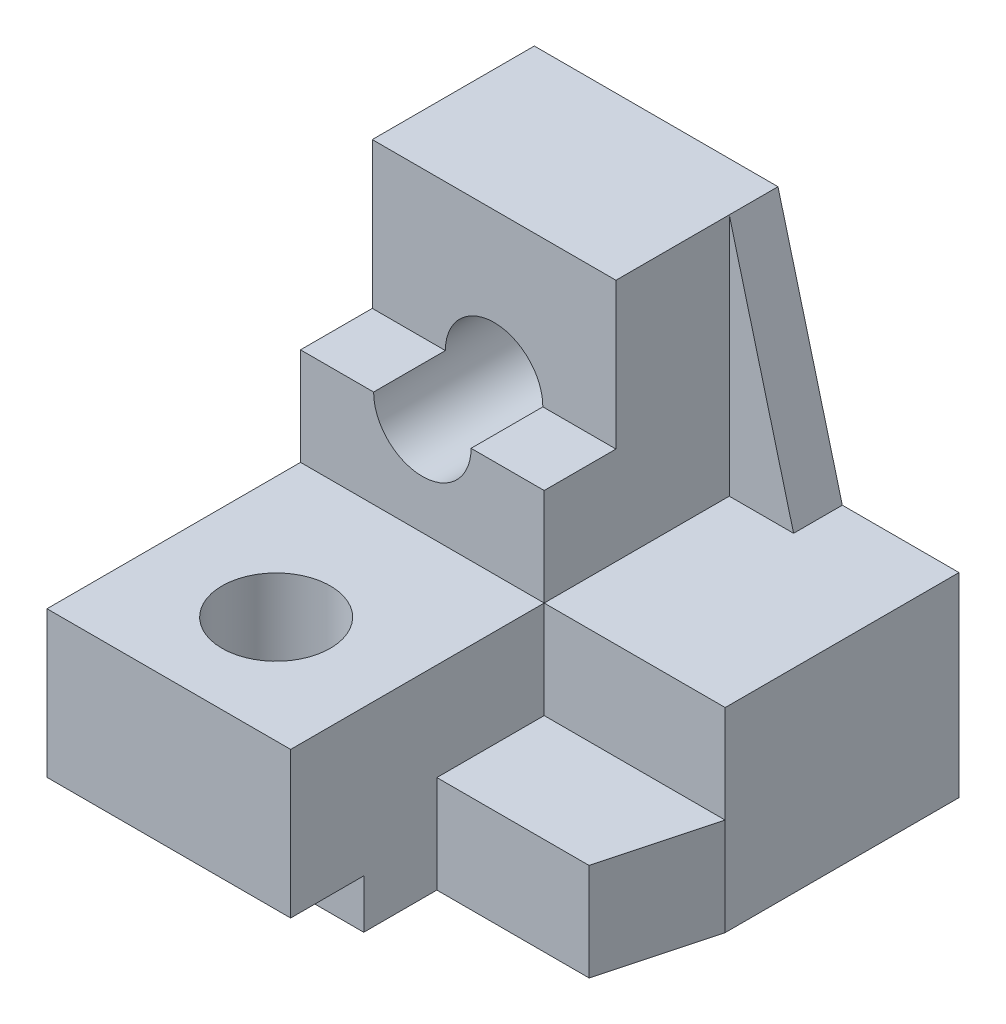
ISO-10303-21;
HEADER;
FILE_DESCRIPTION(('STEP AP214'),'2;1');
FILE_NAME('part.step','',(''),(''),'','','');
FILE_SCHEMA(('AUTOMOTIVE_DESIGN { 1 0 10303 214 1 1 1 1 }'));
ENDSEC;
DATA;
#1=APPLICATION_CONTEXT('core data for automotive mechanical design processes');
#2=APPLICATION_PROTOCOL_DEFINITION('international standard','automotive_design',2000,#1);
#3=PRODUCT_CONTEXT('',#1,'mechanical');
#4=PRODUCT('Part','Part','',(#3));
#5=PRODUCT_RELATED_PRODUCT_CATEGORY('part','',(#4));
#6=PRODUCT_DEFINITION_FORMATION('','',#4);
#7=PRODUCT_DEFINITION_CONTEXT('part definition',#1,'design');
#8=PRODUCT_DEFINITION('design','',#6,#7);
#9=PRODUCT_DEFINITION_SHAPE('','',#8);
#10=(LENGTH_UNIT() NAMED_UNIT(*) SI_UNIT(.MILLI.,.METRE.));
#11=(NAMED_UNIT(*) PLANE_ANGLE_UNIT() SI_UNIT($,.RADIAN.));
#12=(NAMED_UNIT(*) SI_UNIT($,.STERADIAN.) SOLID_ANGLE_UNIT());
#13=UNCERTAINTY_MEASURE_WITH_UNIT(LENGTH_MEASURE(1.E-05),#10,'distance_accuracy_value','');
#14=(GEOMETRIC_REPRESENTATION_CONTEXT(3) GLOBAL_UNCERTAINTY_ASSIGNED_CONTEXT((#13)) GLOBAL_UNIT_ASSIGNED_CONTEXT((#10,
#11,#12)) REPRESENTATION_CONTEXT('',''));
#15=CARTESIAN_POINT('',(0.,0.,0.));
#16=DIRECTION('',(0.,0.,1.));
#17=DIRECTION('',(1.,0.,0.));
#18=AXIS2_PLACEMENT_3D('',#15,#16,#17);
#19=CARTESIAN_POINT('',(0.,60.,0.));
#20=DIRECTION('',(0.,1.,0.));
#21=DIRECTION('',(0.,0.,1.));
#22=AXIS2_PLACEMENT_3D('',#19,#20,#21);
#23=PLANE('',#22);
#24=DIRECTION('',(0.,0.,1.));
#25=VECTOR('',#24,1.);
#26=CARTESIAN_POINT('',(-35.,60.,-50.));
#27=LINE('',#26,#25);
#28=CARTESIAN_POINT('',(-35.,60.,-16.7497125938639));
#29=VERTEX_POINT('',#28);
#30=CARTESIAN_POINT('',(-35.,60.,-2.02212351296029));
#31=VERTEX_POINT('',#30);
#32=EDGE_CURVE('E223',#29,#31,#27,.T.);
#33=ORIENTED_EDGE('',*,*,#32,.F.);
#34=DIRECTION('',(1.,0.,0.));
#35=VECTOR('',#34,1.);
#36=CARTESIAN_POINT('',(-50.,60.,-16.7497125938639));
#37=LINE('',#36,#35);
#38=CARTESIAN_POINT('',(-50.,60.,-16.7497125938639));
#39=VERTEX_POINT('',#38);
#40=EDGE_CURVE('E211',#39,#29,#37,.T.);
#41=ORIENTED_EDGE('',*,*,#40,.F.);
#42=DIRECTION('',(0.,0.,1.));
#43=VECTOR('',#42,1.);
#44=CARTESIAN_POINT('',(-50.,60.,-50.));
#45=LINE('',#44,#43);
#46=CARTESIAN_POINT('',(-50.,60.,-2.02212351296029));
#47=VERTEX_POINT('',#46);
#48=EDGE_CURVE('E227',#39,#47,#45,.T.);
#49=ORIENTED_EDGE('',*,*,#48,.T.);
#50=DIRECTION('',(1.,0.,0.));
#51=VECTOR('',#50,1.);
#52=CARTESIAN_POINT('',(-50.,60.,-2.02212351296029));
#53=LINE('',#52,#51);
#54=EDGE_CURVE('E230',#47,#31,#53,.T.);
#55=ORIENTED_EDGE('',*,*,#54,.T.);
#56=EDGE_LOOP('',(#33,#41,#49,#55));
#57=FACE_BOUND('',#56,.T.);
#58=ADVANCED_FACE('F39',(#57),#23,.T.);
#59=DIRECTION('',(0.,0.,-1.));
#60=VECTOR('',#59,1.);
#61=CARTESIAN_POINT('',(0.,60.,-50.));
#62=LINE('',#61,#60);
#63=CARTESIAN_POINT('',(0.,60.,-2.02212351296029));
#64=VERTEX_POINT('',#63);
#65=CARTESIAN_POINT('',(0.,60.,-16.7497125938639));
#66=VERTEX_POINT('',#65);
#67=EDGE_CURVE('E54',#64,#66,#62,.T.);
#68=ORIENTED_EDGE('',*,*,#67,.T.);
#69=CARTESIAN_POINT('',(-15.,60.,-16.7497125938639));
#70=VERTEX_POINT('',#69);
#71=EDGE_CURVE('E210',#70,#66,#37,.T.);
#72=ORIENTED_EDGE('',*,*,#71,.F.);
#73=DIRECTION('',(0.,0.,1.));
#74=VECTOR('',#73,1.);
#75=CARTESIAN_POINT('',(-15.,60.,-50.));
#76=LINE('',#75,#74);
#77=CARTESIAN_POINT('',(-15.,60.,-2.02212351296029));
#78=VERTEX_POINT('',#77);
#79=EDGE_CURVE('E59',#70,#78,#76,.T.);
#80=ORIENTED_EDGE('',*,*,#79,.T.);
#81=EDGE_CURVE('E229',#78,#64,#53,.T.);
#82=ORIENTED_EDGE('',*,*,#81,.T.);
#83=EDGE_LOOP('',(#68,#72,#80,#82));
#84=FACE_BOUND('',#83,.T.);
#85=ADVANCED_FACE('F358',(#84),#23,.T.);
#86=CARTESIAN_POINT('',(0.,40.,0.));
#87=DIRECTION('',(0.,-1.,0.));
#88=DIRECTION('',(0.,0.,-1.));
#89=AXIS2_PLACEMENT_3D('',#86,#87,#88);
#90=PLANE('',#89);
#91=DIRECTION('',(-1.,0.,0.));
#92=VECTOR('',#91,1.);
#93=CARTESIAN_POINT('',(-50.,40.,-50.));
#94=LINE('',#93,#92);
#95=CARTESIAN_POINT('',(37.1443667407374,40.,-50.));
#96=VERTEX_POINT('',#95);
#97=CARTESIAN_POINT('',(13.2014210229221,40.,-50.));
#98=VERTEX_POINT('',#97);
#99=EDGE_CURVE('E252',#96,#98,#94,.T.);
#100=ORIENTED_EDGE('',*,*,#99,.T.);
#101=DIRECTION('',(0.,0.,-1.));
#102=VECTOR('',#101,1.);
#103=CARTESIAN_POINT('',(13.2014210229221,40.,-40.));
#104=LINE('',#103,#102);
#105=CARTESIAN_POINT('',(13.2014210229221,40.,-40.));
#106=VERTEX_POINT('',#105);
#107=EDGE_CURVE('E177',#106,#98,#104,.T.);
#108=ORIENTED_EDGE('',*,*,#107,.F.);
#109=DIRECTION('',(-1.,0.,0.));
#110=VECTOR('',#109,1.);
#111=CARTESIAN_POINT('',(13.2014210229221,40.,-40.));
#112=LINE('',#111,#110);
#113=CARTESIAN_POINT('',(0.,40.,-40.));
#114=VERTEX_POINT('',#113);
#115=EDGE_CURVE('E178',#106,#114,#112,.T.);
#116=ORIENTED_EDGE('',*,*,#115,.T.);
#117=DIRECTION('',(0.,0.,-1.));
#118=VECTOR('',#117,1.);
#119=CARTESIAN_POINT('',(0.,40.,-50.));
#120=LINE('',#119,#118);
#121=CARTESIAN_POINT('',(0.,40.,-2.02212351296029));
#122=VERTEX_POINT('',#121);
#123=EDGE_CURVE('E194',#122,#114,#120,.T.);
#124=ORIENTED_EDGE('',*,*,#123,.F.);
#125=DIRECTION('',(1.,0.,0.));
#126=VECTOR('',#125,1.);
#127=CARTESIAN_POINT('',(-50.,40.,-2.0221235129603));
#128=LINE('',#127,#126);
#129=CARTESIAN_POINT('',(37.1443667407374,40.,-2.0221235129603));
#130=VERTEX_POINT('',#129);
#131=EDGE_CURVE('E248',#122,#130,#128,.T.);
#132=ORIENTED_EDGE('',*,*,#131,.T.);
#133=DIRECTION('',(0.,0.,-1.));
#134=VECTOR('',#133,1.);
#135=CARTESIAN_POINT('',(37.1443667407374,40.,-50.));
#136=LINE('',#135,#134);
#137=EDGE_CURVE('E250',#130,#96,#136,.T.);
#138=ORIENTED_EDGE('',*,*,#137,.T.);
#139=EDGE_LOOP('',(#100,#108,#116,#124,#132,#138));
#140=FACE_BOUND('',#139,.T.);
#141=ADVANCED_FACE('F350',(#140),#90,.F.);
#142=CARTESIAN_POINT('',(-25.,40.,27.9778764870397));
#143=DIRECTION('',(0.,1.,0.));
#144=DIRECTION('',(0.,0.,1.));
#145=AXIS2_PLACEMENT_3D('',#142,#143,#144);
#146=CIRCLE('',#145,11.1076264005775);
#147=CARTESIAN_POINT('',(-25.,40.,39.0855028876172));
#148=VERTEX_POINT('',#147);
#149=EDGE_CURVE('E269',#148,#148,#146,.T.);
#150=ORIENTED_EDGE('',*,*,#149,.F.);
#151=EDGE_LOOP('',(#150));
#152=FACE_BOUND('',#151,.T.);
#153=DIRECTION('',(1.,0.,0.));
#154=VECTOR('',#153,1.);
#155=CARTESIAN_POINT('',(-50.,40.,-2.02212351296029));
#156=LINE('',#155,#154);
#157=CARTESIAN_POINT('',(-50.,40.,-2.02212351296029));
#158=VERTEX_POINT('',#157);
#159=EDGE_CURVE('E225',#158,#122,#156,.T.);
#160=ORIENTED_EDGE('',*,*,#159,.F.);
#161=DIRECTION('',(0.,0.,1.));
#162=VECTOR('',#161,1.);
#163=CARTESIAN_POINT('',(-50.,40.,50.));
#164=LINE('',#163,#162);
#165=CARTESIAN_POINT('',(-50.,40.,50.));
#166=VERTEX_POINT('',#165);
#167=EDGE_CURVE('E304',#158,#166,#164,.T.);
#168=ORIENTED_EDGE('',*,*,#167,.T.);
#169=DIRECTION('',(1.,0.,0.));
#170=VECTOR('',#169,1.);
#171=CARTESIAN_POINT('',(-50.,40.,50.));
#172=LINE('',#171,#170);
#173=CARTESIAN_POINT('',(0.,40.,50.));
#174=VERTEX_POINT('',#173);
#175=EDGE_CURVE('E306',#166,#174,#172,.T.);
#176=ORIENTED_EDGE('',*,*,#175,.T.);
#177=DIRECTION('',(0.,0.,-1.));
#178=VECTOR('',#177,1.);
#179=CARTESIAN_POINT('',(0.,40.,50.));
#180=LINE('',#179,#178);
#181=EDGE_CURVE('E308',#174,#122,#180,.T.);
#182=ORIENTED_EDGE('',*,*,#181,.T.);
#183=EDGE_LOOP('',(#160,#168,#176,#182));
#184=FACE_BOUND('',#183,.T.);
#185=ADVANCED_FACE('F343',(#152,#184),#90,.F.);
#186=CARTESIAN_POINT('',(0.,20.,0.));
#187=DIRECTION('',(0.,-1.,0.));
#188=DIRECTION('',(0.,0.,-1.));
#189=AXIS2_PLACEMENT_3D('',#186,#187,#188);
#190=PLANE('',#189);
#191=DIRECTION('',(1.,0.,0.));
#192=VECTOR('',#191,1.);
#193=CARTESIAN_POINT('',(-50.,20.,-2.0221235129603));
#194=LINE('',#193,#192);
#195=CARTESIAN_POINT('',(0.,20.,-2.0221235129603));
#196=VERTEX_POINT('',#195);
#197=CARTESIAN_POINT('',(37.1443667407374,20.,-2.0221235129603));
#198=VERTEX_POINT('',#197);
#199=EDGE_CURVE('E247',#196,#198,#194,.T.);
#200=ORIENTED_EDGE('',*,*,#199,.F.);
#201=DIRECTION('',(0.,0.,-1.));
#202=VECTOR('',#201,1.);
#203=CARTESIAN_POINT('',(0.,20.,50.));
#204=LINE('',#203,#202);
#205=CARTESIAN_POINT('',(0.,20.,20.));
#206=VERTEX_POINT('',#205);
#207=EDGE_CURVE('E303',#206,#196,#204,.T.);
#208=ORIENTED_EDGE('',*,*,#207,.F.);
#209=DIRECTION('',(-1.,0.,0.));
#210=VECTOR('',#209,1.);
#211=CARTESIAN_POINT('',(0.,20.,20.));
#212=LINE('',#211,#210);
#213=CARTESIAN_POINT('',(31.2435565298211,20.,20.));
#214=VERTEX_POINT('',#213);
#215=EDGE_CURVE('E290',#214,#206,#212,.T.);
#216=ORIENTED_EDGE('',*,*,#215,.F.);
#217=DIRECTION('',(-0.258819045102525,0.,0.965925826289067));
#218=VECTOR('',#217,1.);
#219=CARTESIAN_POINT('',(50.,20.,-50.));
#220=LINE('',#219,#218);
#221=EDGE_CURVE('E262',#198,#214,#220,.T.);
#222=ORIENTED_EDGE('',*,*,#221,.F.);
#223=EDGE_LOOP('',(#200,#208,#216,#222));
#224=FACE_BOUND('',#223,.T.);
#225=ADVANCED_FACE('F407',(#224),#190,.F.);
#226=CARTESIAN_POINT('',(-50.,20.,50.));
#227=DIRECTION('',(0.,0.,-1.));
#228=DIRECTION('',(-1.,0.,0.));
#229=AXIS2_PLACEMENT_3D('',#226,#227,#228);
#230=PLANE('',#229);
#231=DIRECTION('',(0.,-1.,0.));
#232=VECTOR('',#231,1.);
#233=CARTESIAN_POINT('',(-50.,20.,50.));
#234=LINE('',#233,#232);
#235=CARTESIAN_POINT('',(-50.,10.032008701787,50.));
#236=VERTEX_POINT('',#235);
#237=EDGE_CURVE('E47',#166,#236,#234,.T.);
#238=ORIENTED_EDGE('',*,*,#237,.T.);
#239=DIRECTION('',(1.,0.,0.));
#240=VECTOR('',#239,1.);
#241=CARTESIAN_POINT('',(-50.,10.032008701787,50.));
#242=LINE('',#241,#240);
#243=CARTESIAN_POINT('',(0.,10.032008701787,50.));
#244=VERTEX_POINT('',#243);
#245=EDGE_CURVE('E287',#236,#244,#242,.T.);
#246=ORIENTED_EDGE('',*,*,#245,.T.);
#247=DIRECTION('',(0.,-1.,0.));
#248=VECTOR('',#247,1.);
#249=CARTESIAN_POINT('',(0.,40.,50.));
#250=LINE('',#249,#248);
#251=EDGE_CURVE('E315',#174,#244,#250,.T.);
#252=ORIENTED_EDGE('',*,*,#251,.F.);
#253=ORIENTED_EDGE('',*,*,#175,.F.);
#254=EDGE_LOOP('',(#238,#246,#252,#253));
#255=FACE_BOUND('',#254,.T.);
#256=ADVANCED_FACE('F41',(#255),#230,.F.);
#257=CARTESIAN_POINT('',(-50.,20.,-50.));
#258=DIRECTION('',(0.,0.,-1.));
#259=DIRECTION('',(-1.,0.,0.));
#260=AXIS2_PLACEMENT_3D('',#257,#258,#259);
#261=PLANE('',#260);
#262=DIRECTION('',(-1.,0.,0.));
#263=VECTOR('',#262,1.);
#264=CARTESIAN_POINT('',(-50.,90.,-50.));
#265=LINE('',#264,#263);
#266=CARTESIAN_POINT('',(0.,90.,-50.));
#267=VERTEX_POINT('',#266);
#268=CARTESIAN_POINT('',(-50.,90.,-50.));
#269=VERTEX_POINT('',#268);
#270=EDGE_CURVE('E202',#267,#269,#265,.T.);
#271=ORIENTED_EDGE('',*,*,#270,.F.);
#272=DIRECTION('',(0.255280384498885,-0.966867067021161,0.));
#273=VECTOR('',#272,1.);
#274=CARTESIAN_POINT('',(0.,90.,-50.));
#275=LINE('',#274,#273);
#276=EDGE_CURVE('E172',#267,#98,#275,.T.);
#277=ORIENTED_EDGE('',*,*,#276,.T.);
#278=ORIENTED_EDGE('',*,*,#99,.F.);
#279=DIRECTION('',(0.,-1.,0.));
#280=VECTOR('',#279,1.);
#281=CARTESIAN_POINT('',(37.1443667407374,40.,-50.));
#282=LINE('',#281,#280);
#283=CARTESIAN_POINT('',(37.1443667407374,0.,-50.));
#284=VERTEX_POINT('',#283);
#285=EDGE_CURVE('E255',#96,#284,#282,.T.);
#286=ORIENTED_EDGE('',*,*,#285,.T.);
#287=DIRECTION('',(1.,0.,0.));
#288=VECTOR('',#287,1.);
#289=CARTESIAN_POINT('',(-50.,0.,-50.));
#290=LINE('',#289,#288);
#291=CARTESIAN_POINT('',(-50.,0.,-50.));
#292=VERTEX_POINT('',#291);
#293=EDGE_CURVE('E318',#292,#284,#290,.T.);
#294=ORIENTED_EDGE('',*,*,#293,.F.);
#295=DIRECTION('',(0.,-1.,0.));
#296=VECTOR('',#295,1.);
#297=CARTESIAN_POINT('',(-50.,20.,-50.));
#298=LINE('',#297,#296);
#299=EDGE_CURVE('E11',#269,#292,#298,.T.);
#300=ORIENTED_EDGE('',*,*,#299,.F.);
#301=EDGE_LOOP('',(#271,#277,#278,#286,#294,#300));
#302=FACE_BOUND('',#301,.T.);
#303=CARTESIAN_POINT('',(-25.,60.,-50.));
#304=DIRECTION('',(0.,0.,1.));
#305=DIRECTION('',(1.,0.,0.));
#306=AXIS2_PLACEMENT_3D('',#303,#304,#305);
#307=CIRCLE('',#306,10.);
#308=CARTESIAN_POINT('',(-15.,60.,-50.));
#309=VERTEX_POINT('',#308);
#310=EDGE_CURVE('E219',#309,#309,#307,.T.);
#311=ORIENTED_EDGE('',*,*,#310,.T.);
#312=EDGE_LOOP('',(#311));
#313=FACE_BOUND('',#312,.T.);
#314=ADVANCED_FACE('F415',(#302,#313),#261,.T.);
#315=CARTESIAN_POINT('',(-50.,20.,-50.));
#316=DIRECTION('',(1.,0.,0.));
#317=DIRECTION('',(0.,0.,-1.));
#318=AXIS2_PLACEMENT_3D('',#315,#316,#317);
#319=PLANE('',#318);
#320=DIRECTION('',(0.,1.,0.));
#321=VECTOR('',#320,1.);
#322=CARTESIAN_POINT('',(-50.,0.,35.));
#323=LINE('',#322,#321);
#324=CARTESIAN_POINT('',(-50.,0.,35.));
#325=VERTEX_POINT('',#324);
#326=CARTESIAN_POINT('',(-50.,10.032008701787,35.));
#327=VERTEX_POINT('',#326);
#328=EDGE_CURVE('E276',#325,#327,#323,.T.);
#329=ORIENTED_EDGE('',*,*,#328,.T.);
#330=DIRECTION('',(0.,0.,1.));
#331=VECTOR('',#330,1.);
#332=CARTESIAN_POINT('',(-50.,10.032008701787,35.));
#333=LINE('',#332,#331);
#334=EDGE_CURVE('E279',#327,#236,#333,.T.);
#335=ORIENTED_EDGE('',*,*,#334,.T.);
#336=ORIENTED_EDGE('',*,*,#237,.F.);
#337=ORIENTED_EDGE('',*,*,#167,.F.);
#338=DIRECTION('',(0.,-1.,0.));
#339=VECTOR('',#338,1.);
#340=CARTESIAN_POINT('',(-50.,60.,-2.02212351296029));
#341=LINE('',#340,#339);
#342=EDGE_CURVE('E239',#47,#158,#341,.T.);
#343=ORIENTED_EDGE('',*,*,#342,.F.);
#344=ORIENTED_EDGE('',*,*,#48,.F.);
#345=DIRECTION('',(0.,-1.,0.));
#346=VECTOR('',#345,1.);
#347=CARTESIAN_POINT('',(-50.,80.,-16.7497125938639));
#348=LINE('',#347,#346);
#349=CARTESIAN_POINT('',(-50.,90.,-16.7497125938639));
#350=VERTEX_POINT('',#349);
#351=EDGE_CURVE('E216',#350,#39,#348,.T.);
#352=ORIENTED_EDGE('',*,*,#351,.F.);
#353=DIRECTION('',(0.,0.,1.));
#354=VECTOR('',#353,1.);
#355=CARTESIAN_POINT('',(-50.,90.,-50.));
#356=LINE('',#355,#354);
#357=EDGE_CURVE('E195',#269,#350,#356,.T.);
#358=ORIENTED_EDGE('',*,*,#357,.F.);
#359=ORIENTED_EDGE('',*,*,#299,.T.);
#360=DIRECTION('',(0.,0.,1.));
#361=VECTOR('',#360,1.);
#362=CARTESIAN_POINT('',(-50.,0.,-50.));
#363=LINE('',#362,#361);
#364=EDGE_CURVE('E321',#292,#325,#363,.T.);
#365=ORIENTED_EDGE('',*,*,#364,.T.);
#366=EDGE_LOOP('',(#329,#335,#336,#337,#343,#344,#352,#358,#359,#365));
#367=FACE_BOUND('',#366,.T.);
#368=ADVANCED_FACE('F330',(#367),#319,.F.);
#369=CARTESIAN_POINT('',(0.,0.,0.));
#370=DIRECTION('',(0.,-1.,0.));
#371=DIRECTION('',(0.,0.,-1.));
#372=AXIS2_PLACEMENT_3D('',#369,#370,#371);
#373=PLANE('',#372);
#374=DIRECTION('',(0.,0.,1.));
#375=VECTOR('',#374,1.);
#376=CARTESIAN_POINT('',(37.1443667407374,0.,-50.));
#377=LINE('',#376,#375);
#378=CARTESIAN_POINT('',(37.1443667407374,0.,-2.0221235129603));
#379=VERTEX_POINT('',#378);
#380=EDGE_CURVE('E242',#284,#379,#377,.T.);
#381=ORIENTED_EDGE('',*,*,#380,.T.);
#382=DIRECTION('',(-0.258819045102525,0.,0.965925826289067));
#383=VECTOR('',#382,1.);
#384=CARTESIAN_POINT('',(50.,0.,-50.));
#385=LINE('',#384,#383);
#386=CARTESIAN_POINT('',(31.2435565298211,0.,20.));
#387=VERTEX_POINT('',#386);
#388=EDGE_CURVE('E263',#379,#387,#385,.T.);
#389=ORIENTED_EDGE('',*,*,#388,.T.);
#390=DIRECTION('',(-1.,0.,0.));
#391=VECTOR('',#390,1.);
#392=CARTESIAN_POINT('',(0.,0.,20.));
#393=LINE('',#392,#391);
#394=CARTESIAN_POINT('',(0.,0.,20.));
#395=VERTEX_POINT('',#394);
#396=EDGE_CURVE('E294',#387,#395,#393,.T.);
#397=ORIENTED_EDGE('',*,*,#396,.T.);
#398=DIRECTION('',(0.,0.,1.));
#399=VECTOR('',#398,1.);
#400=CARTESIAN_POINT('',(0.,0.,0.));
#401=LINE('',#400,#399);
#402=CARTESIAN_POINT('',(0.,0.,35.));
#403=VERTEX_POINT('',#402);
#404=EDGE_CURVE('E296',#395,#403,#401,.T.);
#405=ORIENTED_EDGE('',*,*,#404,.T.);
#406=DIRECTION('',(1.,0.,0.));
#407=VECTOR('',#406,1.);
#408=CARTESIAN_POINT('',(-50.,0.,35.));
#409=LINE('',#408,#407);
#410=EDGE_CURVE('E283',#325,#403,#409,.T.);
#411=ORIENTED_EDGE('',*,*,#410,.F.);
#412=ORIENTED_EDGE('',*,*,#364,.F.);
#413=ORIENTED_EDGE('',*,*,#293,.T.);
#414=EDGE_LOOP('',(#381,#389,#397,#405,#411,#412,#413));
#415=FACE_BOUND('',#414,.T.);
#416=ADVANCED_FACE('F406',(#415),#373,.T.);
#417=CARTESIAN_POINT('',(0.,40.,50.));
#418=DIRECTION('',(-1.,0.,0.));
#419=DIRECTION('',(0.,0.,1.));
#420=AXIS2_PLACEMENT_3D('',#417,#418,#419);
#421=PLANE('',#420);
#422=ORIENTED_EDGE('',*,*,#251,.T.);
#423=DIRECTION('',(0.,0.,1.));
#424=VECTOR('',#423,1.);
#425=CARTESIAN_POINT('',(0.,10.032008701787,35.));
#426=LINE('',#425,#424);
#427=CARTESIAN_POINT('',(0.,10.032008701787,35.));
#428=VERTEX_POINT('',#427);
#429=EDGE_CURVE('E280',#428,#244,#426,.T.);
#430=ORIENTED_EDGE('',*,*,#429,.F.);
#431=DIRECTION('',(0.,1.,0.));
#432=VECTOR('',#431,1.);
#433=CARTESIAN_POINT('',(0.,0.,35.));
#434=LINE('',#433,#432);
#435=EDGE_CURVE('E273',#403,#428,#434,.T.);
#436=ORIENTED_EDGE('',*,*,#435,.F.);
#437=ORIENTED_EDGE('',*,*,#404,.F.);
#438=DIRECTION('',(0.,1.,0.));
#439=VECTOR('',#438,1.);
#440=CARTESIAN_POINT('',(0.,0.,20.));
#441=LINE('',#440,#439);
#442=EDGE_CURVE('E299',#395,#206,#441,.T.);
#443=ORIENTED_EDGE('',*,*,#442,.T.);
#444=ORIENTED_EDGE('',*,*,#207,.T.);
#445=DIRECTION('',(0.,-1.,0.));
#446=VECTOR('',#445,1.);
#447=CARTESIAN_POINT('',(0.,40.,-2.02212351296029));
#448=LINE('',#447,#446);
#449=EDGE_CURVE('E311',#122,#196,#448,.T.);
#450=ORIENTED_EDGE('',*,*,#449,.F.);
#451=ORIENTED_EDGE('',*,*,#181,.F.);
#452=EDGE_LOOP('',(#422,#430,#436,#437,#443,#444,#450,#451));
#453=FACE_BOUND('',#452,.T.);
#454=ADVANCED_FACE('F338',(#453),#421,.F.);
#455=CARTESIAN_POINT('',(0.,0.,20.));
#456=DIRECTION('',(0.,0.,-1.));
#457=DIRECTION('',(-1.,0.,0.));
#458=AXIS2_PLACEMENT_3D('',#455,#456,#457);
#459=PLANE('',#458);
#460=ORIENTED_EDGE('',*,*,#396,.F.);
#461=DIRECTION('',(0.,1.,0.));
#462=VECTOR('',#461,1.);
#463=CARTESIAN_POINT('',(31.2435565298211,0.,20.));
#464=LINE('',#463,#462);
#465=EDGE_CURVE('E265',#387,#214,#464,.T.);
#466=ORIENTED_EDGE('',*,*,#465,.T.);
#467=ORIENTED_EDGE('',*,*,#215,.T.);
#468=ORIENTED_EDGE('',*,*,#442,.F.);
#469=EDGE_LOOP('',(#460,#466,#467,#468));
#470=FACE_BOUND('',#469,.T.);
#471=ADVANCED_FACE('F397',(#470),#459,.F.);
#472=CARTESIAN_POINT('',(-50.,10.032008701787,35.));
#473=DIRECTION('',(0.,1.,0.));
#474=DIRECTION('',(0.,0.,1.));
#475=AXIS2_PLACEMENT_3D('',#472,#473,#474);
#476=PLANE('',#475);
#477=ORIENTED_EDGE('',*,*,#429,.T.);
#478=ORIENTED_EDGE('',*,*,#245,.F.);
#479=ORIENTED_EDGE('',*,*,#334,.F.);
#480=DIRECTION('',(1.,0.,0.));
#481=VECTOR('',#480,1.);
#482=CARTESIAN_POINT('',(-50.,10.032008701787,35.));
#483=LINE('',#482,#481);
#484=EDGE_CURVE('E291',#327,#428,#483,.T.);
#485=ORIENTED_EDGE('',*,*,#484,.T.);
#486=EDGE_LOOP('',(#477,#478,#479,#485));
#487=FACE_BOUND('',#486,.T.);
#488=ADVANCED_FACE('F334',(#487),#476,.F.);
#489=CARTESIAN_POINT('',(-50.,0.,35.));
#490=DIRECTION('',(0.,0.,-1.));
#491=DIRECTION('',(-1.,0.,0.));
#492=AXIS2_PLACEMENT_3D('',#489,#490,#491);
#493=PLANE('',#492);
#494=ORIENTED_EDGE('',*,*,#435,.T.);
#495=ORIENTED_EDGE('',*,*,#484,.F.);
#496=ORIENTED_EDGE('',*,*,#328,.F.);
#497=ORIENTED_EDGE('',*,*,#410,.T.);
#498=EDGE_LOOP('',(#494,#495,#496,#497));
#499=FACE_BOUND('',#498,.T.);
#500=ADVANCED_FACE('F393',(#499),#493,.F.);
#501=CARTESIAN_POINT('',(-25.,20.,27.9778764870397));
#502=DIRECTION('',(0.,1.,0.));
#503=DIRECTION('',(0.,0.,1.));
#504=AXIS2_PLACEMENT_3D('',#501,#502,#503);
#505=CYLINDRICAL_SURFACE('',#504,11.1076264005775);
#506=CARTESIAN_POINT('',(-25.,20.,27.9778764870397));
#507=DIRECTION('',(0.,1.,0.));
#508=DIRECTION('',(0.,0.,1.));
#509=AXIS2_PLACEMENT_3D('',#506,#507,#508);
#510=CIRCLE('',#509,11.1076264005775);
#511=CARTESIAN_POINT('',(-25.,20.,39.0855028876172));
#512=VERTEX_POINT('',#511);
#513=EDGE_CURVE('E270',#512,#512,#510,.T.);
#514=ORIENTED_EDGE('',*,*,#513,.F.);
#515=EDGE_LOOP('',(#514));
#516=FACE_BOUND('',#515,.T.);
#517=ORIENTED_EDGE('',*,*,#149,.T.);
#518=EDGE_LOOP('',(#517));
#519=FACE_BOUND('',#518,.T.);
#520=ADVANCED_FACE('F389',(#516,#519),#505,.F.);
#521=CARTESIAN_POINT('',(-25.,20.,27.9778764870397));
#522=DIRECTION('',(0.,1.,0.));
#523=DIRECTION('',(0.,0.,1.));
#524=AXIS2_PLACEMENT_3D('',#521,#522,#523);
#525=PLANE('',#524);
#526=ORIENTED_EDGE('',*,*,#513,.T.);
#527=EDGE_LOOP('',(#526));
#528=FACE_BOUND('',#527,.T.);
#529=ADVANCED_FACE('F385',(#528),#525,.T.);
#530=CARTESIAN_POINT('',(50.,0.,-50.));
#531=DIRECTION('',(-0.965925826289067,0.,-0.258819045102525));
#532=DIRECTION('',(-0.258819045102525,0.,0.965925826289067));
#533=AXIS2_PLACEMENT_3D('',#530,#531,#532);
#534=PLANE('',#533);
#535=ORIENTED_EDGE('',*,*,#388,.F.);
#536=DIRECTION('',(0.,1.,0.));
#537=VECTOR('',#536,1.);
#538=CARTESIAN_POINT('',(37.1443667407374,0.,-2.0221235129603));
#539=LINE('',#538,#537);
#540=EDGE_CURVE('E245',#379,#198,#539,.T.);
#541=ORIENTED_EDGE('',*,*,#540,.T.);
#542=ORIENTED_EDGE('',*,*,#221,.T.);
#543=ORIENTED_EDGE('',*,*,#465,.F.);
#544=EDGE_LOOP('',(#535,#541,#542,#543));
#545=FACE_BOUND('',#544,.T.);
#546=ADVANCED_FACE('F382',(#545),#534,.F.);
#547=CARTESIAN_POINT('',(-50.,40.,-2.0221235129603));
#548=DIRECTION('',(0.,0.,-1.));
#549=DIRECTION('',(-1.,0.,0.));
#550=AXIS2_PLACEMENT_3D('',#547,#548,#549);
#551=PLANE('',#550);
#552=ORIENTED_EDGE('',*,*,#131,.F.);
#553=ORIENTED_EDGE('',*,*,#449,.T.);
#554=ORIENTED_EDGE('',*,*,#199,.T.);
#555=DIRECTION('',(0.,-1.,0.));
#556=VECTOR('',#555,1.);
#557=CARTESIAN_POINT('',(37.1443667407374,40.,-2.0221235129603));
#558=LINE('',#557,#556);
#559=EDGE_CURVE('E259',#130,#198,#558,.T.);
#560=ORIENTED_EDGE('',*,*,#559,.F.);
#561=EDGE_LOOP('',(#552,#553,#554,#560));
#562=FACE_BOUND('',#561,.T.);
#563=ADVANCED_FACE('F346',(#562),#551,.F.);
#564=CARTESIAN_POINT('',(37.1443667407374,40.,-50.));
#565=DIRECTION('',(-1.,0.,0.));
#566=DIRECTION('',(0.,0.,1.));
#567=AXIS2_PLACEMENT_3D('',#564,#565,#566);
#568=PLANE('',#567);
#569=ORIENTED_EDGE('',*,*,#559,.T.);
#570=ORIENTED_EDGE('',*,*,#540,.F.);
#571=ORIENTED_EDGE('',*,*,#380,.F.);
#572=ORIENTED_EDGE('',*,*,#285,.F.);
#573=ORIENTED_EDGE('',*,*,#137,.F.);
#574=EDGE_LOOP('',(#569,#570,#571,#572,#573));
#575=FACE_BOUND('',#574,.T.);
#576=ADVANCED_FACE('F376',(#575),#568,.F.);
#577=CARTESIAN_POINT('',(-50.,60.,-2.02212351296029));
#578=DIRECTION('',(0.,0.,-1.));
#579=DIRECTION('',(-1.,0.,0.));
#580=AXIS2_PLACEMENT_3D('',#577,#578,#579);
#581=PLANE('',#580);
#582=ORIENTED_EDGE('',*,*,#81,.F.);
#583=CARTESIAN_POINT('',(-25.,60.,-2.02212351296029));
#584=DIRECTION('',(0.,0.,1.));
#585=DIRECTION('',(1.,0.,0.));
#586=AXIS2_PLACEMENT_3D('',#583,#584,#585);
#587=CIRCLE('',#586,10.);
#588=EDGE_CURVE('E218',#31,#78,#587,.T.);
#589=ORIENTED_EDGE('',*,*,#588,.F.);
#590=ORIENTED_EDGE('',*,*,#54,.F.);
#591=ORIENTED_EDGE('',*,*,#342,.T.);
#592=ORIENTED_EDGE('',*,*,#159,.T.);
#593=DIRECTION('',(0.,-1.,0.));
#594=VECTOR('',#593,1.);
#595=CARTESIAN_POINT('',(0.,60.,-2.02212351296029));
#596=LINE('',#595,#594);
#597=EDGE_CURVE('E234',#64,#122,#596,.T.);
#598=ORIENTED_EDGE('',*,*,#597,.F.);
#599=EDGE_LOOP('',(#582,#589,#590,#591,#592,#598));
#600=FACE_BOUND('',#599,.T.);
#601=ADVANCED_FACE('F354',(#600),#581,.F.);
#602=CARTESIAN_POINT('',(0.,60.,-50.));
#603=DIRECTION('',(-1.,0.,0.));
#604=DIRECTION('',(0.,0.,1.));
#605=AXIS2_PLACEMENT_3D('',#602,#603,#604);
#606=PLANE('',#605);
#607=ORIENTED_EDGE('',*,*,#123,.T.);
#608=DIRECTION('',(0.,1.,0.));
#609=VECTOR('',#608,1.);
#610=CARTESIAN_POINT('',(0.,60.,-40.));
#611=LINE('',#610,#609);
#612=CARTESIAN_POINT('',(0.,90.,-40.));
#613=VERTEX_POINT('',#612);
#614=EDGE_CURVE('E183',#114,#613,#611,.T.);
#615=ORIENTED_EDGE('',*,*,#614,.T.);
#616=DIRECTION('',(0.,0.,-1.));
#617=VECTOR('',#616,1.);
#618=CARTESIAN_POINT('',(0.,90.,-50.));
#619=LINE('',#618,#617);
#620=CARTESIAN_POINT('',(0.,90.,-16.7497125938639));
#621=VERTEX_POINT('',#620);
#622=EDGE_CURVE('E191',#621,#613,#619,.T.);
#623=ORIENTED_EDGE('',*,*,#622,.F.);
#624=DIRECTION('',(0.,-1.,0.));
#625=VECTOR('',#624,1.);
#626=CARTESIAN_POINT('',(0.,80.,-16.7497125938639));
#627=LINE('',#626,#625);
#628=EDGE_CURVE('E214',#621,#66,#627,.T.);
#629=ORIENTED_EDGE('',*,*,#628,.T.);
#630=ORIENTED_EDGE('',*,*,#67,.F.);
#631=ORIENTED_EDGE('',*,*,#597,.T.);
#632=EDGE_LOOP('',(#607,#615,#623,#629,#630,#631));
#633=FACE_BOUND('',#632,.T.);
#634=ADVANCED_FACE('F189',(#633),#606,.F.);
#635=CARTESIAN_POINT('',(-25.,60.,-50.));
#636=DIRECTION('',(0.,0.,1.));
#637=DIRECTION('',(1.,0.,0.));
#638=AXIS2_PLACEMENT_3D('',#635,#636,#637);
#639=CYLINDRICAL_SURFACE('',#638,10.);
#640=CARTESIAN_POINT('',(-25.,60.,-16.7497125938639));
#641=DIRECTION('',(0.,0.,1.));
#642=DIRECTION('',(-1.,0.,0.));
#643=AXIS2_PLACEMENT_3D('',#640,#641,#642);
#644=CIRCLE('',#643,10.);
#645=EDGE_CURVE('E204',#70,#29,#644,.T.);
#646=ORIENTED_EDGE('',*,*,#645,.T.);
#647=ORIENTED_EDGE('',*,*,#32,.T.);
#648=ORIENTED_EDGE('',*,*,#588,.T.);
#649=ORIENTED_EDGE('',*,*,#79,.F.);
#650=EDGE_LOOP('',(#646,#647,#648,#649));
#651=FACE_BOUND('',#650,.T.);
#652=ORIENTED_EDGE('',*,*,#310,.F.);
#653=EDGE_LOOP('',(#652));
#654=FACE_BOUND('',#653,.T.);
#655=ADVANCED_FACE('F370',(#651,#654),#639,.F.);
#656=CARTESIAN_POINT('',(-50.,80.,-16.7497125938639));
#657=DIRECTION('',(0.,0.,-1.));
#658=DIRECTION('',(-1.,0.,0.));
#659=AXIS2_PLACEMENT_3D('',#656,#657,#658);
#660=PLANE('',#659);
#661=ORIENTED_EDGE('',*,*,#40,.T.);
#662=ORIENTED_EDGE('',*,*,#645,.F.);
#663=ORIENTED_EDGE('',*,*,#71,.T.);
#664=ORIENTED_EDGE('',*,*,#628,.F.);
#665=DIRECTION('',(1.,0.,0.));
#666=VECTOR('',#665,1.);
#667=CARTESIAN_POINT('',(-50.,90.,-16.7497125938639));
#668=LINE('',#667,#666);
#669=EDGE_CURVE('E201',#350,#621,#668,.T.);
#670=ORIENTED_EDGE('',*,*,#669,.F.);
#671=ORIENTED_EDGE('',*,*,#351,.T.);
#672=EDGE_LOOP('',(#661,#662,#663,#664,#670,#671));
#673=FACE_BOUND('',#672,.T.);
#674=ADVANCED_FACE('F357',(#673),#660,.F.);
#675=CARTESIAN_POINT('',(0.,90.,0.));
#676=DIRECTION('',(0.,1.,0.));
#677=DIRECTION('',(0.,0.,1.));
#678=AXIS2_PLACEMENT_3D('',#675,#676,#677);
#679=PLANE('',#678);
#680=ORIENTED_EDGE('',*,*,#357,.T.);
#681=ORIENTED_EDGE('',*,*,#669,.T.);
#682=ORIENTED_EDGE('',*,*,#622,.T.);
#683=DIRECTION('',(0.,0.,-1.));
#684=VECTOR('',#683,1.);
#685=CARTESIAN_POINT('',(0.,90.,-40.));
#686=LINE('',#685,#684);
#687=EDGE_CURVE('E166',#613,#267,#686,.T.);
#688=ORIENTED_EDGE('',*,*,#687,.T.);
#689=ORIENTED_EDGE('',*,*,#270,.T.);
#690=EDGE_LOOP('',(#680,#681,#682,#688,#689));
#691=FACE_BOUND('',#690,.T.);
#692=ADVANCED_FACE('F199',(#691),#679,.T.);
#693=CARTESIAN_POINT('',(0.,0.,-40.));
#694=DIRECTION('',(0.,0.,1.));
#695=DIRECTION('',(1.,0.,0.));
#696=AXIS2_PLACEMENT_3D('',#693,#694,#695);
#697=PLANE('',#696);
#698=ORIENTED_EDGE('',*,*,#614,.F.);
#699=ORIENTED_EDGE('',*,*,#115,.F.);
#700=DIRECTION('',(0.255280384498885,-0.966867067021161,0.));
#701=VECTOR('',#700,1.);
#702=CARTESIAN_POINT('',(0.,90.,-40.));
#703=LINE('',#702,#701);
#704=EDGE_CURVE('E169',#613,#106,#703,.T.);
#705=ORIENTED_EDGE('',*,*,#704,.F.);
#706=EDGE_LOOP('',(#698,#699,#705));
#707=FACE_BOUND('',#706,.T.);
#708=ADVANCED_FACE('F182',(#707),#697,.T.);
#709=CARTESIAN_POINT('',(0.,90.,-40.));
#710=DIRECTION('',(0.966867067021161,0.255280384498885,0.));
#711=DIRECTION('',(-0.255280384498885,0.966867067021161,0.));
#712=AXIS2_PLACEMENT_3D('',#709,#710,#711);
#713=PLANE('',#712);
#714=ORIENTED_EDGE('',*,*,#276,.F.);
#715=ORIENTED_EDGE('',*,*,#687,.F.);
#716=ORIENTED_EDGE('',*,*,#704,.T.);
#717=ORIENTED_EDGE('',*,*,#107,.T.);
#718=EDGE_LOOP('',(#714,#715,#716,#717));
#719=FACE_BOUND('',#718,.T.);
#720=ADVANCED_FACE('F168',(#719),#713,.T.);
#721=CLOSED_SHELL('',(#58,#85,#141,#185,#225,#256,#314,#368,#416,#454,#471,#488,#500,#520,#529,
#546,#563,#576,#601,#634,#655,#674,#692,#708,#720));
#722=MANIFOLD_SOLID_BREP('B2',#721);
#723=ADVANCED_BREP_SHAPE_REPRESENTATION('',(#18,#722),#14);
#724=SHAPE_DEFINITION_REPRESENTATION(#9,#723);
ENDSEC;
END-ISO-10303-21;
